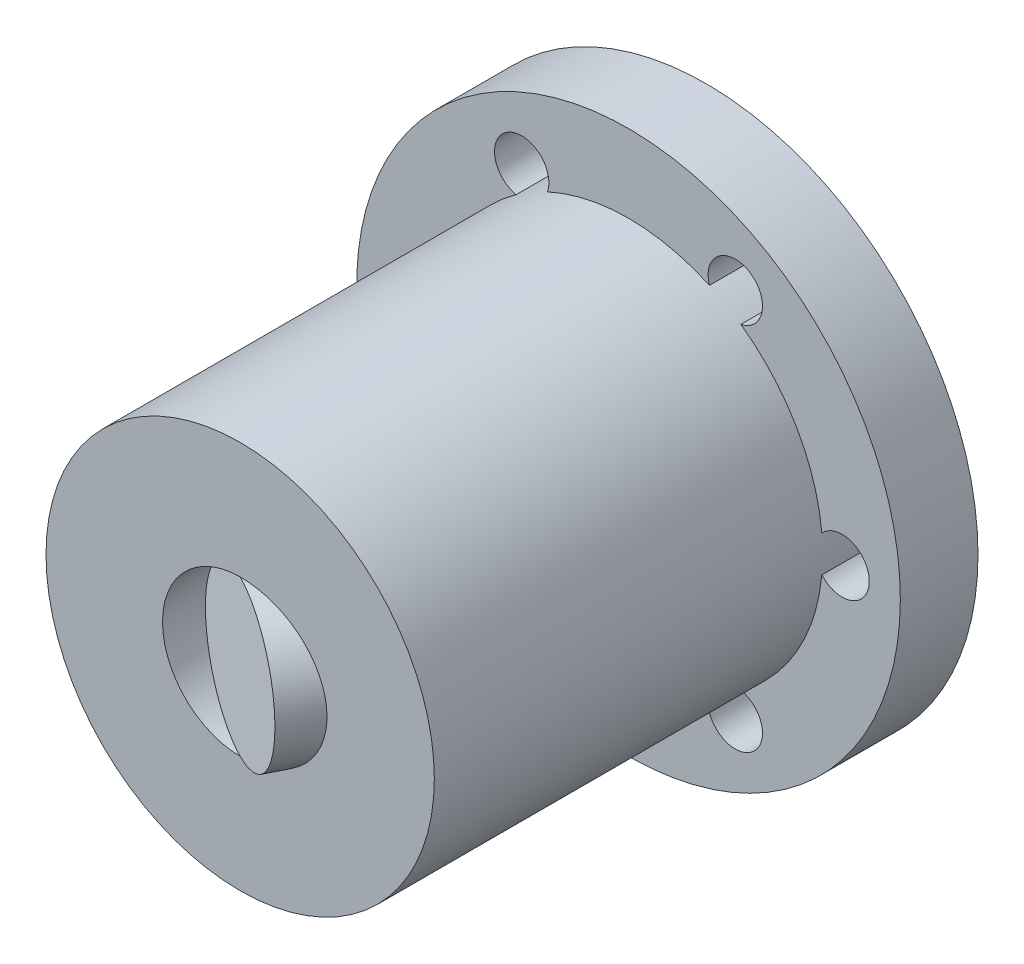
ISO-10303-21;
HEADER;
FILE_DESCRIPTION(('STEP AP214'),'2;1');
FILE_NAME('part.step','',(''),(''),'','','');
FILE_SCHEMA(('AUTOMOTIVE_DESIGN { 1 0 10303 214 1 1 1 1 }'));
ENDSEC;
DATA;
#1=APPLICATION_CONTEXT('core data for automotive mechanical design processes');
#2=APPLICATION_PROTOCOL_DEFINITION('international standard','automotive_design',2000,#1);
#3=PRODUCT_CONTEXT('',#1,'mechanical');
#4=PRODUCT('Part','Part','',(#3));
#5=PRODUCT_RELATED_PRODUCT_CATEGORY('part','',(#4));
#6=PRODUCT_DEFINITION_FORMATION('','',#4);
#7=PRODUCT_DEFINITION_CONTEXT('part definition',#1,'design');
#8=PRODUCT_DEFINITION('design','',#6,#7);
#9=PRODUCT_DEFINITION_SHAPE('','',#8);
#10=(LENGTH_UNIT() NAMED_UNIT(*) SI_UNIT(.MILLI.,.METRE.));
#11=(NAMED_UNIT(*) PLANE_ANGLE_UNIT() SI_UNIT($,.RADIAN.));
#12=(NAMED_UNIT(*) SI_UNIT($,.STERADIAN.) SOLID_ANGLE_UNIT());
#13=UNCERTAINTY_MEASURE_WITH_UNIT(LENGTH_MEASURE(1.E-05),#10,'distance_accuracy_value','');
#14=(GEOMETRIC_REPRESENTATION_CONTEXT(3) GLOBAL_UNCERTAINTY_ASSIGNED_CONTEXT((#13)) GLOBAL_UNIT_ASSIGNED_CONTEXT((#10,
#11,#12)) REPRESENTATION_CONTEXT('',''));
#15=CARTESIAN_POINT('',(0.,0.,0.));
#16=DIRECTION('',(0.,0.,1.));
#17=DIRECTION('',(1.,0.,0.));
#18=AXIS2_PLACEMENT_3D('',#15,#16,#17);
#19=CARTESIAN_POINT('',(0.,0.,0.));
#20=DIRECTION('',(0.447213595499958,0.,0.894427190999916));
#21=DIRECTION('',(0.,-1.,0.));
#22=AXIS2_PLACEMENT_3D('',#19,#20,#21);
#23=PLANE('',#22);
#24=CARTESIAN_POINT('',(0.,0.,0.));
#25=DIRECTION('',(0.447213595499958,0.,0.894427190999916));
#26=DIRECTION('',(0.894427190999916,0.,-0.447213595499958));
#27=AXIS2_PLACEMENT_3D('',#24,#25,#26);
#28=CIRCLE('',#27,20.);
#29=CARTESIAN_POINT('',(1.045702277981E-13,20.,0.));
#30=VERTEX_POINT('',#29);
#31=CARTESIAN_POINT('',(0.,-20.,0.));
#32=VERTEX_POINT('',#31);
#33=EDGE_CURVE('E24',#30,#32,#28,.T.);
#34=ORIENTED_EDGE('',*,*,#33,.F.);
#35=CARTESIAN_POINT('',(0.,0.,0.));
#36=DIRECTION('',(0.447213595499958,0.,0.894427190999916));
#37=DIRECTION('',(0.,-1.,0.));
#38=AXIS2_PLACEMENT_3D('',#35,#36,#37);
#39=CIRCLE('',#38,20.);
#40=EDGE_CURVE('E10',#32,#30,#39,.T.);
#41=ORIENTED_EDGE('',*,*,#40,.F.);
#42=EDGE_LOOP('',(#34,#41));
#43=FACE_BOUND('',#42,.T.);
#44=ADVANCED_FACE('F16',(#43),#23,.F.);
#45=CARTESIAN_POINT('',(0.,0.,0.));
#46=DIRECTION('',(0.447213595499958,0.,0.894427190999916));
#47=DIRECTION('',(0.894427190999916,0.,-0.447213595499958));
#48=AXIS2_PLACEMENT_3D('',#45,#46,#47);
#49=CYLINDRICAL_SURFACE('',#48,20.);
#50=CARTESIAN_POINT('',(0.,0.,0.));
#51=DIRECTION('',(0.,0.,1.));
#52=DIRECTION('',(1.,0.,0.));
#53=AXIS2_PLACEMENT_3D('',#50,#51,#52);
#54=ELLIPSE('',#53,22.360679774998,20.);
#55=CARTESIAN_POINT('',(22.360679774998,0.,0.));
#56=VERTEX_POINT('',#55);
#57=EDGE_CURVE('E365',#56,#30,#54,.T.);
#58=ORIENTED_EDGE('',*,*,#57,.F.);
#59=CARTESIAN_POINT('',(0.,0.,0.));
#60=DIRECTION('',(0.,0.,1.));
#61=DIRECTION('',(1.,0.,0.));
#62=AXIS2_PLACEMENT_3D('',#59,#60,#61);
#63=ELLIPSE('',#62,22.360679774998,20.);
#64=EDGE_CURVE('E361',#32,#56,#63,.T.);
#65=ORIENTED_EDGE('',*,*,#64,.F.);
#66=ORIENTED_EDGE('',*,*,#40,.T.);
#67=EDGE_LOOP('',(#58,#65,#66));
#68=FACE_BOUND('',#67,.T.);
#69=ADVANCED_FACE('F437',(#68),#49,.T.);
#70=CARTESIAN_POINT('',(0.,0.,0.));
#71=DIRECTION('',(0.447213595499958,0.,0.894427190999916));
#72=DIRECTION('',(0.894427190999916,0.,-0.447213595499958));
#73=AXIS2_PLACEMENT_3D('',#70,#71,#72);
#74=CYLINDRICAL_SURFACE('',#73,20.);
#75=CARTESIAN_POINT('',(0.,0.,0.));
#76=DIRECTION('',(0.973248989467825,0.,-0.229752920546959));
#77=DIRECTION('',(-0.229752920546959,0.,-0.973248989467825));
#78=AXIS2_PLACEMENT_3D('',#75,#76,#77);
#79=ELLIPSE('',#78,87.050035979313,20.);
#80=CARTESIAN_POINT('',(4.721359549996,19.434730870266,20.));
#81=VERTEX_POINT('',#80);
#82=EDGE_CURVE('E224',#30,#81,#79,.T.);
#83=ORIENTED_EDGE('',*,*,#82,.F.);
#84=ORIENTED_EDGE('',*,*,#33,.T.);
#85=CARTESIAN_POINT('',(0.,0.,0.));
#86=DIRECTION('',(0.973248989467825,0.,-0.229752920546959));
#87=DIRECTION('',(-0.229752920546959,0.,-0.973248989467825));
#88=AXIS2_PLACEMENT_3D('',#85,#86,#87);
#89=ELLIPSE('',#88,87.050035979313,20.);
#90=CARTESIAN_POINT('',(4.721359549996,-19.43473087026,20.));
#91=VERTEX_POINT('',#90);
#92=EDGE_CURVE('E221',#91,#32,#89,.T.);
#93=ORIENTED_EDGE('',*,*,#92,.F.);
#94=CARTESIAN_POINT('',(0.,0.,0.));
#95=DIRECTION('',(0.973248989467825,0.,-0.229752920546959));
#96=DIRECTION('',(-0.229752920546959,0.,-0.973248989467825));
#97=AXIS2_PLACEMENT_3D('',#94,#95,#96);
#98=ELLIPSE('',#97,87.050035979313,20.);
#99=CARTESIAN_POINT('',(14.164078649987,-14.12015849758,60.));
#100=VERTEX_POINT('',#99);
#101=EDGE_CURVE('E225',#100,#91,#98,.T.);
#102=ORIENTED_EDGE('',*,*,#101,.F.);
#103=CARTESIAN_POINT('',(30.,0.,60.));
#104=DIRECTION('',(0.,0.,1.));
#105=DIRECTION('',(1.,0.,0.));
#106=AXIS2_PLACEMENT_3D('',#103,#104,#105);
#107=ELLIPSE('',#106,22.360679774998,20.);
#108=CARTESIAN_POINT('',(14.164078649987,14.120158497587,60.));
#109=VERTEX_POINT('',#108);
#110=EDGE_CURVE('E36',#109,#100,#107,.T.);
#111=ORIENTED_EDGE('',*,*,#110,.F.);
#112=CARTESIAN_POINT('',(0.,0.,0.));
#113=DIRECTION('',(0.973248989467825,0.,-0.229752920546959));
#114=DIRECTION('',(-0.229752920546959,0.,-0.973248989467825));
#115=AXIS2_PLACEMENT_3D('',#112,#113,#114);
#116=ELLIPSE('',#115,87.050035979313,20.);
#117=EDGE_CURVE('E43',#81,#109,#116,.T.);
#118=ORIENTED_EDGE('',*,*,#117,.F.);
#119=EDGE_LOOP('',(#83,#84,#93,#102,#111,#118));
#120=FACE_BOUND('',#119,.T.);
#121=ADVANCED_FACE('F410',(#120),#74,.T.);
#122=CARTESIAN_POINT('',(30.,0.,60.));
#123=DIRECTION('',(-0.447213595499958,0.,0.894427190999916));
#124=DIRECTION('',(0.894427190999916,0.,0.447213595499958));
#125=AXIS2_PLACEMENT_3D('',#122,#123,#124);
#126=CYLINDRICAL_SURFACE('',#125,20.);
#127=CARTESIAN_POINT('',(0.,0.,120.));
#128=DIRECTION('',(-0.973248989467825,0.,-0.229752920546959));
#129=DIRECTION('',(0.229752920546959,0.,-0.973248989467825));
#130=AXIS2_PLACEMENT_3D('',#127,#128,#129);
#131=ELLIPSE('',#130,87.050035979313,20.);
#132=CARTESIAN_POINT('',(1.101881965426E-13,-20.,120.));
#133=VERTEX_POINT('',#132);
#134=EDGE_CURVE('E270',#100,#133,#131,.T.);
#135=ORIENTED_EDGE('',*,*,#134,.T.);
#136=CARTESIAN_POINT('',(0.,0.,120.));
#137=DIRECTION('',(-0.447213595499958,0.,0.894427190999916));
#138=DIRECTION('',(0.894427190999916,0.,0.447213595499958));
#139=AXIS2_PLACEMENT_3D('',#136,#137,#138);
#140=CIRCLE('',#139,20.);
#141=CARTESIAN_POINT('',(1.096951990107E-13,20.,120.));
#142=VERTEX_POINT('',#141);
#143=EDGE_CURVE('E297',#142,#133,#140,.T.);
#144=ORIENTED_EDGE('',*,*,#143,.F.);
#145=CARTESIAN_POINT('',(0.,0.,120.));
#146=DIRECTION('',(-0.973248989467825,0.,-0.229752920546959));
#147=DIRECTION('',(0.229752920546959,0.,-0.973248989467825));
#148=AXIS2_PLACEMENT_3D('',#145,#146,#147);
#149=ELLIPSE('',#148,87.050035979313,20.);
#150=EDGE_CURVE('E316',#142,#109,#149,.T.);
#151=ORIENTED_EDGE('',*,*,#150,.T.);
#152=ORIENTED_EDGE('',*,*,#110,.T.);
#153=EDGE_LOOP('',(#135,#144,#151,#152));
#154=FACE_BOUND('',#153,.T.);
#155=ADVANCED_FACE('F407',(#154),#126,.T.);
#156=CARTESIAN_POINT('',(0.,0.,120.));
#157=DIRECTION('',(-0.447213595499958,0.,0.894427190999916));
#158=DIRECTION('',(0.,1.,0.));
#159=AXIS2_PLACEMENT_3D('',#156,#157,#158);
#160=PLANE('',#159);
#161=CARTESIAN_POINT('',(0.,0.,120.));
#162=DIRECTION('',(0.447213595499958,0.,-0.894427190999916));
#163=DIRECTION('',(0.,1.,0.));
#164=AXIS2_PLACEMENT_3D('',#161,#162,#163);
#165=CIRCLE('',#164,20.);
#166=EDGE_CURVE('E266',#142,#133,#165,.T.);
#167=ORIENTED_EDGE('',*,*,#166,.F.);
#168=ORIENTED_EDGE('',*,*,#143,.T.);
#169=EDGE_LOOP('',(#167,#168));
#170=FACE_BOUND('',#169,.T.);
#171=ADVANCED_FACE('F422',(#170),#160,.T.);
#172=CARTESIAN_POINT('',(0.,0.,0.));
#173=DIRECTION('',(0.,0.,1.));
#174=DIRECTION('',(1.,0.,0.));
#175=AXIS2_PLACEMENT_3D('',#172,#173,#174);
#176=CYLINDRICAL_SURFACE('',#175,70.);
#177=DIRECTION('',(0.,0.,1.));
#178=VECTOR('',#177,1.);
#179=CARTESIAN_POINT('',(70.,0.,0.));
#180=LINE('',#179,#178);
#181=CARTESIAN_POINT('',(70.,0.,0.));
#182=VERTEX_POINT('',#181);
#183=CARTESIAN_POINT('',(70.,0.,20.));
#184=VERTEX_POINT('',#183);
#185=EDGE_CURVE('E300',#182,#184,#180,.T.);
#186=ORIENTED_EDGE('',*,*,#185,.F.);
#187=CARTESIAN_POINT('',(0.,0.,0.));
#188=DIRECTION('',(0.,0.,1.));
#189=DIRECTION('',(1.,0.,0.));
#190=AXIS2_PLACEMENT_3D('',#187,#188,#189);
#191=CIRCLE('',#190,70.);
#192=EDGE_CURVE('E349',#182,#182,#191,.T.);
#193=ORIENTED_EDGE('',*,*,#192,.T.);
#194=ORIENTED_EDGE('',*,*,#185,.T.);
#195=CARTESIAN_POINT('',(0.,0.,20.));
#196=DIRECTION('',(0.,0.,1.));
#197=DIRECTION('',(1.,0.,0.));
#198=AXIS2_PLACEMENT_3D('',#195,#196,#197);
#199=CIRCLE('',#198,70.);
#200=EDGE_CURVE('E301',#184,#184,#199,.T.);
#201=ORIENTED_EDGE('',*,*,#200,.F.);
#202=EDGE_LOOP('',(#186,#193,#194,#201));
#203=FACE_BOUND('',#202,.T.);
#204=ADVANCED_FACE('F424',(#203),#176,.T.);
#205=CARTESIAN_POINT('',(0.,0.,0.));
#206=DIRECTION('',(0.,0.,-1.));
#207=DIRECTION('',(1.,0.,0.));
#208=AXIS2_PLACEMENT_3D('',#205,#206,#207);
#209=CYLINDRICAL_SURFACE('',#208,20.);
#210=ORIENTED_EDGE('',*,*,#134,.F.);
#211=ORIENTED_EDGE('',*,*,#101,.T.);
#212=ORIENTED_EDGE('',*,*,#92,.T.);
#213=CARTESIAN_POINT('',(0.,0.,0.));
#214=DIRECTION('',(0.,0.,1.));
#215=DIRECTION('',(1.,0.,0.));
#216=AXIS2_PLACEMENT_3D('',#213,#214,#215);
#217=CIRCLE('',#216,20.);
#218=EDGE_CURVE('E357',#30,#32,#217,.T.);
#219=ORIENTED_EDGE('',*,*,#218,.F.);
#220=ORIENTED_EDGE('',*,*,#82,.T.);
#221=ORIENTED_EDGE('',*,*,#117,.T.);
#222=ORIENTED_EDGE('',*,*,#150,.F.);
#223=CARTESIAN_POINT('',(0.,0.,120.));
#224=DIRECTION('',(0.,0.,-1.));
#225=DIRECTION('',(1.,0.,0.));
#226=AXIS2_PLACEMENT_3D('',#223,#224,#225);
#227=CIRCLE('',#226,20.);
#228=EDGE_CURVE('E339',#133,#142,#227,.T.);
#229=ORIENTED_EDGE('',*,*,#228,.F.);
#230=EDGE_LOOP('',(#210,#211,#212,#219,#220,#221,#222,#229));
#231=FACE_BOUND('',#230,.T.);
#232=ADVANCED_FACE('F413',(#231),#209,.F.);
#233=CARTESIAN_POINT('',(30.,0.,60.));
#234=DIRECTION('',(-0.447213595499958,0.,0.894427190999916));
#235=DIRECTION('',(0.894427190999916,0.,0.447213595499958));
#236=AXIS2_PLACEMENT_3D('',#233,#234,#235);
#237=CYLINDRICAL_SURFACE('',#236,20.);
#238=CARTESIAN_POINT('',(0.,0.,120.));
#239=DIRECTION('',(0.,0.,1.));
#240=DIRECTION('',(-1.,0.,0.));
#241=AXIS2_PLACEMENT_3D('',#238,#239,#240);
#242=ELLIPSE('',#241,22.360679774998,20.);
#243=CARTESIAN_POINT('',(22.360679774998,0.,120.));
#244=VERTEX_POINT('',#243);
#245=EDGE_CURVE('E335',#133,#244,#242,.T.);
#246=ORIENTED_EDGE('',*,*,#245,.T.);
#247=CARTESIAN_POINT('',(0.,0.,120.));
#248=DIRECTION('',(0.,0.,1.));
#249=DIRECTION('',(-1.,0.,0.));
#250=AXIS2_PLACEMENT_3D('',#247,#248,#249);
#251=ELLIPSE('',#250,22.360679774998,20.);
#252=EDGE_CURVE('E343',#244,#142,#251,.T.);
#253=ORIENTED_EDGE('',*,*,#252,.T.);
#254=ORIENTED_EDGE('',*,*,#166,.T.);
#255=EDGE_LOOP('',(#246,#253,#254));
#256=FACE_BOUND('',#255,.T.);
#257=ADVANCED_FACE('F420',(#256),#237,.T.);
#258=CARTESIAN_POINT('',(27.5,47.631397208144,0.));
#259=DIRECTION('',(0.,0.,-1.));
#260=DIRECTION('',(0.50000000000019,0.866025403784329,0.));
#261=AXIS2_PLACEMENT_3D('',#258,#259,#260);
#262=CYLINDRICAL_SURFACE('',#261,7.);
#263=CARTESIAN_POINT('',(27.5,47.631397208144,0.));
#264=DIRECTION('',(0.,0.,1.));
#265=DIRECTION('',(0.204527558777917,-0.978860806090603,0.));
#266=AXIS2_PLACEMENT_3D('',#263,#264,#265);
#267=CIRCLE('',#266,7.);
#268=CARTESIAN_POINT('',(28.931692911443,40.77937156551,0.));
#269=VERTEX_POINT('',#268);
#270=CARTESIAN_POINT('',(20.850125270374,45.445266818556,0.));
#271=VERTEX_POINT('',#270);
#272=EDGE_CURVE('E369',#269,#271,#267,.T.);
#273=ORIENTED_EDGE('',*,*,#272,.F.);
#274=DIRECTION('',(0.,0.,1.));
#275=VECTOR('',#274,1.);
#276=CARTESIAN_POINT('',(28.931692911444,40.77937156551,0.));
#277=LINE('',#276,#275);
#278=CARTESIAN_POINT('',(28.931692911444,40.77937156551,20.));
#279=VERTEX_POINT('',#278);
#280=EDGE_CURVE('E232',#269,#279,#277,.T.);
#281=ORIENTED_EDGE('',*,*,#280,.T.);
#282=CARTESIAN_POINT('',(27.5,47.631397208144,20.));
#283=DIRECTION('',(0.,0.,-1.));
#284=DIRECTION('',(-0.949982104232186,-0.312304341370061,0.));
#285=AXIS2_PLACEMENT_3D('',#282,#283,#284);
#286=CIRCLE('',#285,7.);
#287=CARTESIAN_POINT('',(20.850125270374,45.445266818556,20.));
#288=VERTEX_POINT('',#287);
#289=EDGE_CURVE('E388',#288,#279,#286,.T.);
#290=ORIENTED_EDGE('',*,*,#289,.F.);
#291=DIRECTION('',(0.,0.,1.));
#292=VECTOR('',#291,1.);
#293=CARTESIAN_POINT('',(20.850125270374,45.445266818556,0.));
#294=LINE('',#293,#292);
#295=EDGE_CURVE('E226',#271,#288,#294,.T.);
#296=ORIENTED_EDGE('',*,*,#295,.F.);
#297=EDGE_LOOP('',(#273,#281,#290,#296));
#298=FACE_BOUND('',#297,.T.);
#299=ADVANCED_FACE('F486',(#298),#262,.F.);
#300=CARTESIAN_POINT('',(-27.5,47.631397208144,0.));
#301=DIRECTION('',(0.,0.,-1.));
#302=DIRECTION('',(-0.50000000000019,0.866025403784329,0.));
#303=AXIS2_PLACEMENT_3D('',#300,#301,#302);
#304=CYLINDRICAL_SURFACE('',#303,7.);
#305=CARTESIAN_POINT('',(-27.5,47.631397208144,0.));
#306=DIRECTION('',(0.,0.,1.));
#307=DIRECTION('',(0.949982104232186,-0.312304341370061,0.));
#308=AXIS2_PLACEMENT_3D('',#305,#306,#307);
#309=CIRCLE('',#308,7.);
#310=CARTESIAN_POINT('',(-20.85012527037,45.445266818556,0.));
#311=VERTEX_POINT('',#310);
#312=CARTESIAN_POINT('',(-28.93169291144,40.77937156551,0.));
#313=VERTEX_POINT('',#312);
#314=EDGE_CURVE('E257',#311,#313,#309,.T.);
#315=ORIENTED_EDGE('',*,*,#314,.F.);
#316=DIRECTION('',(0.,0.,1.));
#317=VECTOR('',#316,1.);
#318=CARTESIAN_POINT('',(-20.85012527037,45.445266818556,0.));
#319=LINE('',#318,#317);
#320=CARTESIAN_POINT('',(-20.85012527037,45.445266818556,20.));
#321=VERTEX_POINT('',#320);
#322=EDGE_CURVE('E265',#311,#321,#319,.T.);
#323=ORIENTED_EDGE('',*,*,#322,.T.);
#324=CARTESIAN_POINT('',(-27.5,47.631397208144,20.));
#325=DIRECTION('',(0.,0.,-1.));
#326=DIRECTION('',(-0.204527558777917,-0.978860806090603,0.));
#327=AXIS2_PLACEMENT_3D('',#324,#325,#326);
#328=CIRCLE('',#327,7.);
#329=CARTESIAN_POINT('',(-28.93169291144,40.77937156551,20.));
#330=VERTEX_POINT('',#329);
#331=EDGE_CURVE('E385',#330,#321,#328,.T.);
#332=ORIENTED_EDGE('',*,*,#331,.F.);
#333=DIRECTION('',(0.,0.,1.));
#334=VECTOR('',#333,1.);
#335=CARTESIAN_POINT('',(-28.93169291144,40.77937156551,0.));
#336=LINE('',#335,#334);
#337=EDGE_CURVE('E248',#313,#330,#336,.T.);
#338=ORIENTED_EDGE('',*,*,#337,.F.);
#339=EDGE_LOOP('',(#315,#323,#332,#338));
#340=FACE_BOUND('',#339,.T.);
#341=ADVANCED_FACE('F488',(#340),#304,.F.);
#342=CARTESIAN_POINT('',(-55.,0.,0.));
#343=DIRECTION('',(0.,0.,-1.));
#344=DIRECTION('',(-1.,0.,0.));
#345=AXIS2_PLACEMENT_3D('',#342,#343,#344);
#346=CYLINDRICAL_SURFACE('',#345,7.);
#347=CARTESIAN_POINT('',(-55.,0.,0.));
#348=DIRECTION('',(0.,0.,1.));
#349=DIRECTION('',(0.745454545454673,0.666556464720707,0.));
#350=AXIS2_PLACEMENT_3D('',#347,#348,#349);
#351=CIRCLE('',#350,7.);
#352=CARTESIAN_POINT('',(-49.78181818181,4.665895253046,0.));
#353=VERTEX_POINT('',#352);
#354=CARTESIAN_POINT('',(-49.78181818181,-4.665895253046,0.));
#355=VERTEX_POINT('',#354);
#356=EDGE_CURVE('E372',#353,#355,#351,.T.);
#357=ORIENTED_EDGE('',*,*,#356,.F.);
#358=DIRECTION('',(0.,0.,1.));
#359=VECTOR('',#358,1.);
#360=CARTESIAN_POINT('',(-49.78181818181,4.665895253046,0.));
#361=LINE('',#360,#359);
#362=CARTESIAN_POINT('',(-49.78181818181,4.665895253046,20.));
#363=VERTEX_POINT('',#362);
#364=EDGE_CURVE('E281',#353,#363,#361,.T.);
#365=ORIENTED_EDGE('',*,*,#364,.T.);
#366=CARTESIAN_POINT('',(-55.,0.,20.));
#367=DIRECTION('',(0.,0.,-1.));
#368=DIRECTION('',(0.745454545454673,-0.666556464720707,0.));
#369=AXIS2_PLACEMENT_3D('',#366,#367,#368);
#370=CIRCLE('',#369,7.);
#371=CARTESIAN_POINT('',(-49.78181818181,-4.665895253046,20.));
#372=VERTEX_POINT('',#371);
#373=EDGE_CURVE('E382',#372,#363,#370,.T.);
#374=ORIENTED_EDGE('',*,*,#373,.F.);
#375=DIRECTION('',(0.,0.,1.));
#376=VECTOR('',#375,1.);
#377=CARTESIAN_POINT('',(-49.78181818181,-4.665895253046,0.));
#378=LINE('',#377,#376);
#379=EDGE_CURVE('E286',#355,#372,#378,.T.);
#380=ORIENTED_EDGE('',*,*,#379,.F.);
#381=EDGE_LOOP('',(#357,#365,#374,#380));
#382=FACE_BOUND('',#381,.T.);
#383=ADVANCED_FACE('F494',(#382),#346,.F.);
#384=CARTESIAN_POINT('',(-27.5,-47.63139720814,0.));
#385=DIRECTION('',(0.,0.,-1.));
#386=DIRECTION('',(-0.50000000000019,-0.866025403784329,0.));
#387=AXIS2_PLACEMENT_3D('',#384,#385,#386);
#388=CYLINDRICAL_SURFACE('',#387,7.);
#389=CARTESIAN_POINT('',(-27.5,-47.63139720814,0.));
#390=DIRECTION('',(0.,0.,1.));
#391=DIRECTION('',(-0.204527558777917,0.978860806090603,0.));
#392=AXIS2_PLACEMENT_3D('',#389,#390,#391);
#393=CIRCLE('',#392,7.);
#394=CARTESIAN_POINT('',(-28.93169291144,-40.77937156551,0.));
#395=VERTEX_POINT('',#394);
#396=CARTESIAN_POINT('',(-20.85012527037,-45.44526681855,0.));
#397=VERTEX_POINT('',#396);
#398=EDGE_CURVE('E254',#395,#397,#393,.T.);
#399=ORIENTED_EDGE('',*,*,#398,.F.);
#400=DIRECTION('',(0.,0.,1.));
#401=VECTOR('',#400,1.);
#402=CARTESIAN_POINT('',(-28.93169291144,-40.77937156551,0.));
#403=LINE('',#402,#401);
#404=CARTESIAN_POINT('',(-28.93169291144,-40.77937156551,20.));
#405=VERTEX_POINT('',#404);
#406=EDGE_CURVE('E293',#395,#405,#403,.T.);
#407=ORIENTED_EDGE('',*,*,#406,.T.);
#408=CARTESIAN_POINT('',(-27.5,-47.63139720814,20.));
#409=DIRECTION('',(0.,0.,-1.));
#410=DIRECTION('',(0.949982104232186,0.312304341370061,0.));
#411=AXIS2_PLACEMENT_3D('',#408,#409,#410);
#412=CIRCLE('',#411,7.);
#413=CARTESIAN_POINT('',(-20.85012527037,-45.44526681855,20.));
#414=VERTEX_POINT('',#413);
#415=EDGE_CURVE('E305',#414,#405,#412,.T.);
#416=ORIENTED_EDGE('',*,*,#415,.F.);
#417=DIRECTION('',(0.,0.,1.));
#418=VECTOR('',#417,1.);
#419=CARTESIAN_POINT('',(-20.85012527037,-45.44526681855,0.));
#420=LINE('',#419,#418);
#421=EDGE_CURVE('E237',#397,#414,#420,.T.);
#422=ORIENTED_EDGE('',*,*,#421,.F.);
#423=EDGE_LOOP('',(#399,#407,#416,#422));
#424=FACE_BOUND('',#423,.T.);
#425=ADVANCED_FACE('F475',(#424),#388,.F.);
#426=CARTESIAN_POINT('',(27.5,-47.63139720814,0.));
#427=DIRECTION('',(0.,0.,-1.));
#428=DIRECTION('',(0.50000000000019,-0.866025403784329,0.));
#429=AXIS2_PLACEMENT_3D('',#426,#427,#428);
#430=CYLINDRICAL_SURFACE('',#429,7.);
#431=CARTESIAN_POINT('',(27.5,-47.63139720814,0.));
#432=DIRECTION('',(0.,0.,1.));
#433=DIRECTION('',(-0.949982104232186,0.312304341370061,0.));
#434=AXIS2_PLACEMENT_3D('',#431,#432,#433);
#435=CIRCLE('',#434,7.);
#436=CARTESIAN_POINT('',(20.850125270374,-45.44526681855,0.));
#437=VERTEX_POINT('',#436);
#438=CARTESIAN_POINT('',(28.931692911443,-40.77937156551,0.));
#439=VERTEX_POINT('',#438);
#440=EDGE_CURVE('E258',#437,#439,#435,.T.);
#441=ORIENTED_EDGE('',*,*,#440,.F.);
#442=DIRECTION('',(0.,0.,1.));
#443=VECTOR('',#442,1.);
#444=CARTESIAN_POINT('',(20.850125270374,-45.44526681855,0.));
#445=LINE('',#444,#443);
#446=CARTESIAN_POINT('',(20.850125270374,-45.44526681855,20.));
#447=VERTEX_POINT('',#446);
#448=EDGE_CURVE('E313',#437,#447,#445,.T.);
#449=ORIENTED_EDGE('',*,*,#448,.T.);
#450=CARTESIAN_POINT('',(27.5,-47.63139720814,20.));
#451=DIRECTION('',(0.,0.,-1.));
#452=DIRECTION('',(0.204527558777917,0.978860806090603,0.));
#453=AXIS2_PLACEMENT_3D('',#450,#451,#452);
#454=CIRCLE('',#453,7.);
#455=CARTESIAN_POINT('',(28.931692911444,-40.77937156551,20.));
#456=VERTEX_POINT('',#455);
#457=EDGE_CURVE('E271',#456,#447,#454,.T.);
#458=ORIENTED_EDGE('',*,*,#457,.F.);
#459=DIRECTION('',(0.,0.,1.));
#460=VECTOR('',#459,1.);
#461=CARTESIAN_POINT('',(28.931692911444,-40.77937156551,0.));
#462=LINE('',#461,#460);
#463=EDGE_CURVE('E323',#439,#456,#462,.T.);
#464=ORIENTED_EDGE('',*,*,#463,.F.);
#465=EDGE_LOOP('',(#441,#449,#458,#464));
#466=FACE_BOUND('',#465,.T.);
#467=ADVANCED_FACE('F466',(#466),#430,.F.);
#468=CARTESIAN_POINT('',(0.,0.,20.));
#469=DIRECTION('',(0.,0.,1.));
#470=DIRECTION('',(1.,0.,0.));
#471=AXIS2_PLACEMENT_3D('',#468,#469,#470);
#472=PLANE('',#471);
#473=ORIENTED_EDGE('',*,*,#415,.T.);
#474=CARTESIAN_POINT('',(0.,0.,20.));
#475=DIRECTION('',(0.,0.,1.));
#476=DIRECTION('',(1.,0.,0.));
#477=AXIS2_PLACEMENT_3D('',#474,#475,#476);
#478=CIRCLE('',#477,50.);
#479=EDGE_CURVE('E220',#372,#405,#478,.T.);
#480=ORIENTED_EDGE('',*,*,#479,.F.);
#481=ORIENTED_EDGE('',*,*,#373,.T.);
#482=CARTESIAN_POINT('',(0.,0.,20.));
#483=DIRECTION('',(0.,0.,1.));
#484=DIRECTION('',(1.,0.,0.));
#485=AXIS2_PLACEMENT_3D('',#482,#483,#484);
#486=CIRCLE('',#485,50.);
#487=EDGE_CURVE('E252',#330,#363,#486,.T.);
#488=ORIENTED_EDGE('',*,*,#487,.F.);
#489=ORIENTED_EDGE('',*,*,#331,.T.);
#490=CARTESIAN_POINT('',(0.,0.,20.));
#491=DIRECTION('',(0.,0.,1.));
#492=DIRECTION('',(1.,0.,0.));
#493=AXIS2_PLACEMENT_3D('',#490,#491,#492);
#494=CIRCLE('',#493,50.);
#495=EDGE_CURVE('E230',#288,#321,#494,.T.);
#496=ORIENTED_EDGE('',*,*,#495,.F.);
#497=ORIENTED_EDGE('',*,*,#289,.T.);
#498=CARTESIAN_POINT('',(0.,0.,20.));
#499=DIRECTION('',(0.,0.,1.));
#500=DIRECTION('',(1.,0.,0.));
#501=AXIS2_PLACEMENT_3D('',#498,#499,#500);
#502=CIRCLE('',#501,50.);
#503=CARTESIAN_POINT('',(49.781818181818,4.665895253046,20.));
#504=VERTEX_POINT('',#503);
#505=EDGE_CURVE('E236',#504,#279,#502,.T.);
#506=ORIENTED_EDGE('',*,*,#505,.F.);
#507=CARTESIAN_POINT('',(55.,0.,20.));
#508=DIRECTION('',(0.,0.,1.));
#509=DIRECTION('',(-0.745454545454673,-0.666556464720707,0.));
#510=AXIS2_PLACEMENT_3D('',#507,#508,#509);
#511=CIRCLE('',#510,7.);
#512=CARTESIAN_POINT('',(49.781818181818,-4.665895253046,20.));
#513=VERTEX_POINT('',#512);
#514=EDGE_CURVE('E306',#513,#504,#511,.T.);
#515=ORIENTED_EDGE('',*,*,#514,.F.);
#516=CARTESIAN_POINT('',(0.,0.,20.));
#517=DIRECTION('',(0.,0.,1.));
#518=DIRECTION('',(1.,0.,0.));
#519=AXIS2_PLACEMENT_3D('',#516,#517,#518);
#520=CIRCLE('',#519,50.);
#521=EDGE_CURVE('E328',#456,#513,#520,.T.);
#522=ORIENTED_EDGE('',*,*,#521,.F.);
#523=ORIENTED_EDGE('',*,*,#457,.T.);
#524=CARTESIAN_POINT('',(0.,0.,20.));
#525=DIRECTION('',(0.,0.,1.));
#526=DIRECTION('',(1.,0.,0.));
#527=AXIS2_PLACEMENT_3D('',#524,#525,#526);
#528=CIRCLE('',#527,50.);
#529=EDGE_CURVE('E240',#414,#447,#528,.T.);
#530=ORIENTED_EDGE('',*,*,#529,.F.);
#531=EDGE_LOOP('',(#473,#480,#481,#488,#489,#496,#497,#506,#515,#522,#523,#530));
#532=FACE_BOUND('',#531,.T.);
#533=ORIENTED_EDGE('',*,*,#200,.T.);
#534=EDGE_LOOP('',(#533));
#535=FACE_BOUND('',#534,.T.);
#536=ADVANCED_FACE('F464',(#532,#535),#472,.T.);
#537=CARTESIAN_POINT('',(55.,0.,0.));
#538=DIRECTION('',(0.,0.,-1.));
#539=DIRECTION('',(1.,0.,0.));
#540=AXIS2_PLACEMENT_3D('',#537,#538,#539);
#541=CYLINDRICAL_SURFACE('',#540,7.);
#542=DIRECTION('',(0.,0.,1.));
#543=VECTOR('',#542,1.);
#544=CARTESIAN_POINT('',(49.781818181818,-4.665895253046,0.));
#545=LINE('',#544,#543);
#546=CARTESIAN_POINT('',(49.781818181819,-4.665895253048,0.));
#547=VERTEX_POINT('',#546);
#548=EDGE_CURVE('E199',#547,#513,#545,.T.);
#549=ORIENTED_EDGE('',*,*,#548,.T.);
#550=ORIENTED_EDGE('',*,*,#514,.T.);
#551=DIRECTION('',(0.,0.,1.));
#552=VECTOR('',#551,1.);
#553=CARTESIAN_POINT('',(49.781818181818,4.665895253046,0.));
#554=LINE('',#553,#552);
#555=CARTESIAN_POINT('',(49.781818181819,4.665895253048,0.));
#556=VERTEX_POINT('',#555);
#557=EDGE_CURVE('E211',#556,#504,#554,.T.);
#558=ORIENTED_EDGE('',*,*,#557,.F.);
#559=CARTESIAN_POINT('',(55.,0.,0.));
#560=DIRECTION('',(0.,0.,1.));
#561=DIRECTION('',(-0.745454545454228,-0.666556464721204,0.));
#562=AXIS2_PLACEMENT_3D('',#559,#560,#561);
#563=CIRCLE('',#562,7.);
#564=EDGE_CURVE('E207',#547,#556,#563,.T.);
#565=ORIENTED_EDGE('',*,*,#564,.F.);
#566=EDGE_LOOP('',(#549,#550,#558,#565));
#567=FACE_BOUND('',#566,.T.);
#568=ADVANCED_FACE('F449',(#567),#541,.F.);
#569=CARTESIAN_POINT('',(0.,0.,0.));
#570=DIRECTION('',(0.,0.,1.));
#571=DIRECTION('',(1.,0.,0.));
#572=AXIS2_PLACEMENT_3D('',#569,#570,#571);
#573=PLANE('',#572);
#574=CARTESIAN_POINT('',(0.,0.,0.));
#575=DIRECTION('',(0.,0.,1.));
#576=DIRECTION('',(1.,0.,0.));
#577=AXIS2_PLACEMENT_3D('',#574,#575,#576);
#578=CIRCLE('',#577,50.);
#579=EDGE_CURVE('E285',#353,#355,#578,.T.);
#580=ORIENTED_EDGE('',*,*,#579,.F.);
#581=ORIENTED_EDGE('',*,*,#356,.T.);
#582=EDGE_LOOP('',(#580,#581));
#583=FACE_BOUND('',#582,.T.);
#584=CARTESIAN_POINT('',(0.,0.,0.));
#585=DIRECTION('',(0.,0.,1.));
#586=DIRECTION('',(1.,0.,0.));
#587=AXIS2_PLACEMENT_3D('',#584,#585,#586);
#588=CIRCLE('',#587,50.);
#589=EDGE_CURVE('E231',#269,#271,#588,.T.);
#590=ORIENTED_EDGE('',*,*,#589,.F.);
#591=ORIENTED_EDGE('',*,*,#272,.T.);
#592=EDGE_LOOP('',(#590,#591));
#593=FACE_BOUND('',#592,.T.);
#594=ORIENTED_EDGE('',*,*,#218,.T.);
#595=ORIENTED_EDGE('',*,*,#64,.T.);
#596=ORIENTED_EDGE('',*,*,#57,.T.);
#597=EDGE_LOOP('',(#594,#595,#596));
#598=FACE_BOUND('',#597,.T.);
#599=ORIENTED_EDGE('',*,*,#314,.T.);
#600=CARTESIAN_POINT('',(0.,0.,0.));
#601=DIRECTION('',(0.,0.,1.));
#602=DIRECTION('',(1.,0.,0.));
#603=AXIS2_PLACEMENT_3D('',#600,#601,#602);
#604=CIRCLE('',#603,50.);
#605=EDGE_CURVE('E253',#311,#313,#604,.T.);
#606=ORIENTED_EDGE('',*,*,#605,.F.);
#607=EDGE_LOOP('',(#599,#606));
#608=FACE_BOUND('',#607,.T.);
#609=CARTESIAN_POINT('',(0.,0.,0.));
#610=DIRECTION('',(0.,0.,1.));
#611=DIRECTION('',(1.,0.,0.));
#612=AXIS2_PLACEMENT_3D('',#609,#610,#611);
#613=CIRCLE('',#612,50.);
#614=EDGE_CURVE('E241',#395,#397,#613,.T.);
#615=ORIENTED_EDGE('',*,*,#614,.F.);
#616=ORIENTED_EDGE('',*,*,#398,.T.);
#617=EDGE_LOOP('',(#615,#616));
#618=FACE_BOUND('',#617,.T.);
#619=CARTESIAN_POINT('',(0.,0.,0.));
#620=DIRECTION('',(0.,0.,1.));
#621=DIRECTION('',(1.,0.,0.));
#622=AXIS2_PLACEMENT_3D('',#619,#620,#621);
#623=CIRCLE('',#622,50.);
#624=EDGE_CURVE('E320',#437,#439,#623,.T.);
#625=ORIENTED_EDGE('',*,*,#624,.F.);
#626=ORIENTED_EDGE('',*,*,#440,.T.);
#627=EDGE_LOOP('',(#625,#626));
#628=FACE_BOUND('',#627,.T.);
#629=ORIENTED_EDGE('',*,*,#192,.F.);
#630=EDGE_LOOP('',(#629));
#631=FACE_BOUND('',#630,.T.);
#632=CARTESIAN_POINT('',(0.,0.,0.));
#633=DIRECTION('',(0.,0.,1.));
#634=DIRECTION('',(1.,0.,0.));
#635=AXIS2_PLACEMENT_3D('',#632,#633,#634);
#636=CIRCLE('',#635,50.);
#637=CARTESIAN_POINT('',(50.,0.,0.));
#638=VERTEX_POINT('',#637);
#639=EDGE_CURVE('E205',#638,#556,#636,.T.);
#640=ORIENTED_EDGE('',*,*,#639,.F.);
#641=CARTESIAN_POINT('',(0.,0.,0.));
#642=DIRECTION('',(0.,0.,1.));
#643=DIRECTION('',(1.,0.,0.));
#644=AXIS2_PLACEMENT_3D('',#641,#642,#643);
#645=CIRCLE('',#644,50.);
#646=EDGE_CURVE('E191',#547,#638,#645,.T.);
#647=ORIENTED_EDGE('',*,*,#646,.F.);
#648=ORIENTED_EDGE('',*,*,#564,.T.);
#649=EDGE_LOOP('',(#640,#647,#648));
#650=FACE_BOUND('',#649,.T.);
#651=ADVANCED_FACE('F206',(#583,#593,#598,#608,#618,#628,#631,#650),#573,.F.);
#652=CARTESIAN_POINT('',(0.,0.,120.));
#653=DIRECTION('',(0.,0.,1.));
#654=DIRECTION('',(1.,0.,0.));
#655=AXIS2_PLACEMENT_3D('',#652,#653,#654);
#656=PLANE('',#655);
#657=ORIENTED_EDGE('',*,*,#245,.F.);
#658=ORIENTED_EDGE('',*,*,#228,.T.);
#659=ORIENTED_EDGE('',*,*,#252,.F.);
#660=EDGE_LOOP('',(#657,#658,#659));
#661=FACE_BOUND('',#660,.T.);
#662=CARTESIAN_POINT('',(0.,0.,120.));
#663=DIRECTION('',(0.,0.,1.));
#664=DIRECTION('',(1.,0.,0.));
#665=AXIS2_PLACEMENT_3D('',#662,#663,#664);
#666=CIRCLE('',#665,50.);
#667=CARTESIAN_POINT('',(50.,0.,120.));
#668=VERTEX_POINT('',#667);
#669=EDGE_CURVE('E202',#668,#668,#666,.T.);
#670=ORIENTED_EDGE('',*,*,#669,.T.);
#671=EDGE_LOOP('',(#670));
#672=FACE_BOUND('',#671,.T.);
#673=ADVANCED_FACE('F417',(#661,#672),#656,.T.);
#674=CARTESIAN_POINT('',(0.,0.,0.));
#675=DIRECTION('',(0.,0.,1.));
#676=DIRECTION('',(1.,0.,0.));
#677=AXIS2_PLACEMENT_3D('',#674,#675,#676);
#678=CYLINDRICAL_SURFACE('',#677,50.);
#679=DIRECTION('',(0.,0.,1.));
#680=VECTOR('',#679,1.);
#681=CARTESIAN_POINT('',(50.,0.,0.));
#682=LINE('',#681,#680);
#683=EDGE_CURVE('E196',#638,#668,#682,.T.);
#684=ORIENTED_EDGE('',*,*,#683,.F.);
#685=ORIENTED_EDGE('',*,*,#639,.T.);
#686=ORIENTED_EDGE('',*,*,#557,.T.);
#687=ORIENTED_EDGE('',*,*,#505,.T.);
#688=ORIENTED_EDGE('',*,*,#280,.F.);
#689=ORIENTED_EDGE('',*,*,#589,.T.);
#690=ORIENTED_EDGE('',*,*,#295,.T.);
#691=ORIENTED_EDGE('',*,*,#495,.T.);
#692=ORIENTED_EDGE('',*,*,#322,.F.);
#693=ORIENTED_EDGE('',*,*,#605,.T.);
#694=ORIENTED_EDGE('',*,*,#337,.T.);
#695=ORIENTED_EDGE('',*,*,#487,.T.);
#696=ORIENTED_EDGE('',*,*,#364,.F.);
#697=ORIENTED_EDGE('',*,*,#579,.T.);
#698=ORIENTED_EDGE('',*,*,#379,.T.);
#699=ORIENTED_EDGE('',*,*,#479,.T.);
#700=ORIENTED_EDGE('',*,*,#406,.F.);
#701=ORIENTED_EDGE('',*,*,#614,.T.);
#702=ORIENTED_EDGE('',*,*,#421,.T.);
#703=ORIENTED_EDGE('',*,*,#529,.T.);
#704=ORIENTED_EDGE('',*,*,#448,.F.);
#705=ORIENTED_EDGE('',*,*,#624,.T.);
#706=ORIENTED_EDGE('',*,*,#463,.T.);
#707=ORIENTED_EDGE('',*,*,#521,.T.);
#708=ORIENTED_EDGE('',*,*,#548,.F.);
#709=ORIENTED_EDGE('',*,*,#646,.T.);
#710=ORIENTED_EDGE('',*,*,#683,.T.);
#711=ORIENTED_EDGE('',*,*,#669,.F.);
#712=EDGE_LOOP('',(#684,#685,#686,#687,#688,#689,#690,#691,#692,#693,#694,#695,#696,#697,#698,
#699,#700,#701,#702,#703,#704,#705,#706,#707,#708,#709,#710,#711));
#713=FACE_BOUND('',#712,.T.);
#714=ADVANCED_FACE('F194',(#713),#678,.T.);
#715=CLOSED_SHELL('',(#44,#69,#121,#155,#171,#204,#232,#257,#299,#341,#383,#425,#467,#536,#568,
#651,#673,#714));
#716=MANIFOLD_SOLID_BREP('B1',#715);
#717=ADVANCED_BREP_SHAPE_REPRESENTATION('',(#18,#716),#14);
#718=SHAPE_DEFINITION_REPRESENTATION(#9,#717);
ENDSEC;
END-ISO-10303-21;
